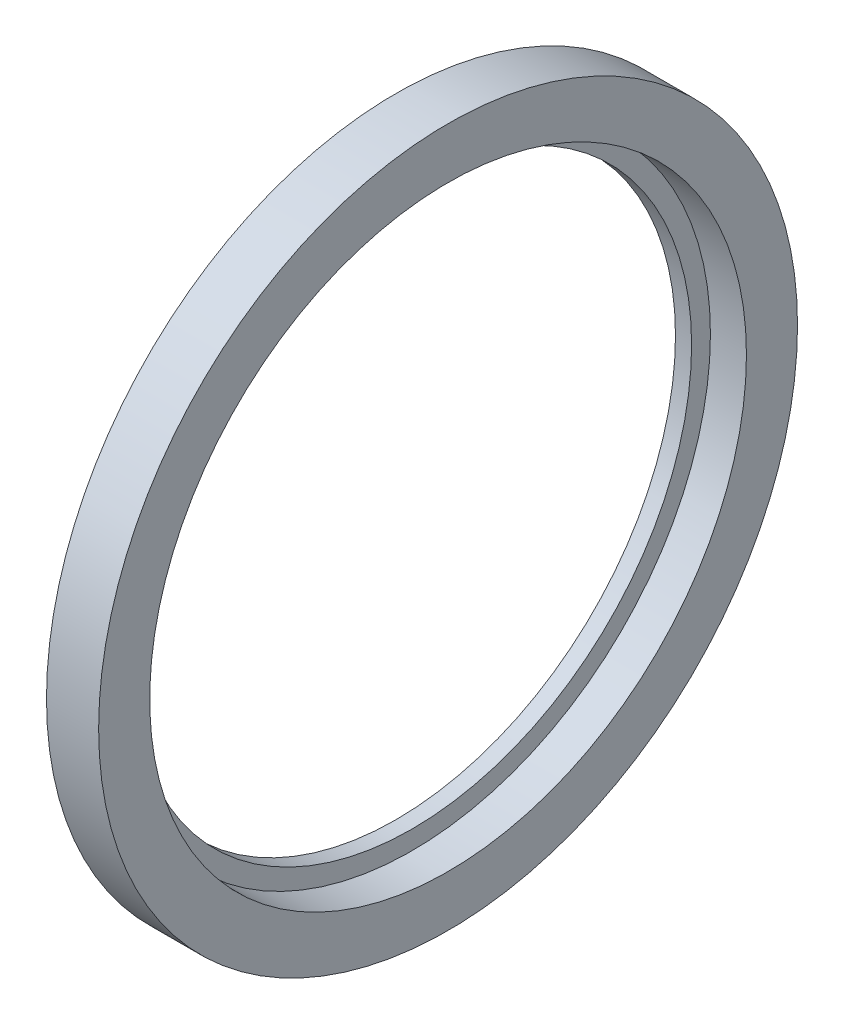
ISO-10303-21;
HEADER;
FILE_DESCRIPTION(('STEP AP214'),'2;1');
FILE_NAME('part.step','',(''),(''),'','','');
FILE_SCHEMA(('AUTOMOTIVE_DESIGN { 1 0 10303 214 1 1 1 1 }'));
ENDSEC;
DATA;
#1=APPLICATION_CONTEXT('core data for automotive mechanical design processes');
#2=APPLICATION_PROTOCOL_DEFINITION('international standard','automotive_design',2000,#1);
#3=PRODUCT_CONTEXT('',#1,'mechanical');
#4=PRODUCT('Part','Part','',(#3));
#5=PRODUCT_RELATED_PRODUCT_CATEGORY('part','',(#4));
#6=PRODUCT_DEFINITION_FORMATION('','',#4);
#7=PRODUCT_DEFINITION_CONTEXT('part definition',#1,'design');
#8=PRODUCT_DEFINITION('design','',#6,#7);
#9=PRODUCT_DEFINITION_SHAPE('','',#8);
#10=(LENGTH_UNIT() NAMED_UNIT(*) SI_UNIT(.MILLI.,.METRE.));
#11=(NAMED_UNIT(*) PLANE_ANGLE_UNIT() SI_UNIT($,.RADIAN.));
#12=(NAMED_UNIT(*) SI_UNIT($,.STERADIAN.) SOLID_ANGLE_UNIT());
#13=UNCERTAINTY_MEASURE_WITH_UNIT(LENGTH_MEASURE(1.E-05),#10,'distance_accuracy_value','');
#14=(GEOMETRIC_REPRESENTATION_CONTEXT(3) GLOBAL_UNCERTAINTY_ASSIGNED_CONTEXT((#13)) GLOBAL_UNIT_ASSIGNED_CONTEXT((#10,
#11,#12)) REPRESENTATION_CONTEXT('',''));
#15=CARTESIAN_POINT('',(0.,0.,0.));
#16=DIRECTION('',(0.,0.,1.));
#17=DIRECTION('',(1.,0.,0.));
#18=AXIS2_PLACEMENT_3D('',#15,#16,#17);
#19=CARTESIAN_POINT('',(12.285,0.,0.));
#20=DIRECTION('',(1.,0.,0.));
#21=DIRECTION('',(0.,0.,-1.));
#22=AXIS2_PLACEMENT_3D('',#19,#20,#21);
#23=CYLINDRICAL_SURFACE('',#22,52.);
#24=CARTESIAN_POINT('',(3.,0.,0.));
#25=DIRECTION('',(1.,0.,0.));
#26=DIRECTION('',(0.,0.,-1.));
#27=AXIS2_PLACEMENT_3D('',#24,#25,#26);
#28=CIRCLE('',#27,52.);
#29=CARTESIAN_POINT('',(3.,0.,-52.));
#30=VERTEX_POINT('',#29);
#31=EDGE_CURVE('E65',#30,#30,#28,.T.);
#32=ORIENTED_EDGE('',*,*,#31,.T.);
#33=EDGE_LOOP('',(#32));
#34=FACE_BOUND('',#33,.T.);
#35=CARTESIAN_POINT('',(0.,0.,0.));
#36=DIRECTION('',(1.,0.,0.));
#37=DIRECTION('',(0.,0.,-1.));
#38=AXIS2_PLACEMENT_3D('',#35,#36,#37);
#39=CIRCLE('',#38,52.);
#40=CARTESIAN_POINT('',(0.,0.,-52.));
#41=VERTEX_POINT('',#40);
#42=EDGE_CURVE('E12',#41,#41,#39,.T.);
#43=ORIENTED_EDGE('',*,*,#42,.F.);
#44=EDGE_LOOP('',(#43));
#45=FACE_BOUND('',#44,.T.);
#46=ADVANCED_FACE('F43',(#34,#45),#23,.F.);
#47=CARTESIAN_POINT('',(0.,52.,0.));
#48=DIRECTION('',(-1.,0.,0.));
#49=DIRECTION('',(0.,0.,1.));
#50=AXIS2_PLACEMENT_3D('',#47,#48,#49);
#51=PLANE('',#50);
#52=ORIENTED_EDGE('',*,*,#42,.T.);
#53=EDGE_LOOP('',(#52));
#54=FACE_BOUND('',#53,.T.);
#55=CARTESIAN_POINT('',(0.,0.,0.));
#56=DIRECTION('',(1.,0.,0.));
#57=DIRECTION('',(0.,0.,-1.));
#58=AXIS2_PLACEMENT_3D('',#55,#56,#57);
#59=CIRCLE('',#58,65.);
#60=CARTESIAN_POINT('',(0.,0.,-65.));
#61=VERTEX_POINT('',#60);
#62=EDGE_CURVE('E49',#61,#61,#59,.T.);
#63=ORIENTED_EDGE('',*,*,#62,.F.);
#64=EDGE_LOOP('',(#63));
#65=FACE_BOUND('',#64,.T.);
#66=ADVANCED_FACE('F83',(#54,#65),#51,.T.);
#67=CARTESIAN_POINT('',(12.285,0.,0.));
#68=DIRECTION('',(1.,0.,0.));
#69=DIRECTION('',(0.,0.,-1.));
#70=AXIS2_PLACEMENT_3D('',#67,#68,#69);
#71=CYLINDRICAL_SURFACE('',#70,65.);
#72=ORIENTED_EDGE('',*,*,#62,.T.);
#73=EDGE_LOOP('',(#72));
#74=FACE_BOUND('',#73,.T.);
#75=CARTESIAN_POINT('',(9.7,0.,0.));
#76=DIRECTION('',(1.,0.,0.));
#77=DIRECTION('',(0.,0.,-1.));
#78=AXIS2_PLACEMENT_3D('',#75,#76,#77);
#79=CIRCLE('',#78,65.);
#80=CARTESIAN_POINT('',(9.7,0.,-65.));
#81=VERTEX_POINT('',#80);
#82=EDGE_CURVE('E53',#81,#81,#79,.T.);
#83=ORIENTED_EDGE('',*,*,#82,.F.);
#84=EDGE_LOOP('',(#83));
#85=FACE_BOUND('',#84,.T.);
#86=ADVANCED_FACE('F87',(#74,#85),#71,.T.);
#87=CARTESIAN_POINT('',(9.7,65.,0.));
#88=DIRECTION('',(1.,0.,0.));
#89=DIRECTION('',(0.,0.,-1.));
#90=AXIS2_PLACEMENT_3D('',#87,#88,#89);
#91=PLANE('',#90);
#92=ORIENTED_EDGE('',*,*,#82,.T.);
#93=EDGE_LOOP('',(#92));
#94=FACE_BOUND('',#93,.T.);
#95=CARTESIAN_POINT('',(9.7,0.,0.));
#96=DIRECTION('',(1.,0.,0.));
#97=DIRECTION('',(0.,0.,-1.));
#98=AXIS2_PLACEMENT_3D('',#95,#96,#97);
#99=CIRCLE('',#98,55.5);
#100=CARTESIAN_POINT('',(9.7,0.,-55.5));
#101=VERTEX_POINT('',#100);
#102=EDGE_CURVE('E57',#101,#101,#99,.T.);
#103=ORIENTED_EDGE('',*,*,#102,.F.);
#104=EDGE_LOOP('',(#103));
#105=FACE_BOUND('',#104,.T.);
#106=ADVANCED_FACE('F79',(#94,#105),#91,.T.);
#107=CARTESIAN_POINT('',(12.285,0.,0.));
#108=DIRECTION('',(1.,0.,0.));
#109=DIRECTION('',(0.,0.,-1.));
#110=AXIS2_PLACEMENT_3D('',#107,#108,#109);
#111=CYLINDRICAL_SURFACE('',#110,55.5);
#112=ORIENTED_EDGE('',*,*,#102,.T.);
#113=EDGE_LOOP('',(#112));
#114=FACE_BOUND('',#113,.T.);
#115=CARTESIAN_POINT('',(3.,0.,0.));
#116=DIRECTION('',(1.,0.,0.));
#117=DIRECTION('',(0.,0.,-1.));
#118=AXIS2_PLACEMENT_3D('',#115,#116,#117);
#119=CIRCLE('',#118,55.5);
#120=CARTESIAN_POINT('',(3.,0.,-55.5));
#121=VERTEX_POINT('',#120);
#122=EDGE_CURVE('E62',#121,#121,#119,.T.);
#123=ORIENTED_EDGE('',*,*,#122,.F.);
#124=EDGE_LOOP('',(#123));
#125=FACE_BOUND('',#124,.T.);
#126=ADVANCED_FACE('F73',(#114,#125),#111,.F.);
#127=CARTESIAN_POINT('',(3.,55.5,0.));
#128=DIRECTION('',(1.,0.,0.));
#129=DIRECTION('',(0.,0.,-1.));
#130=AXIS2_PLACEMENT_3D('',#127,#128,#129);
#131=PLANE('',#130);
#132=ORIENTED_EDGE('',*,*,#122,.T.);
#133=EDGE_LOOP('',(#132));
#134=FACE_BOUND('',#133,.T.);
#135=ORIENTED_EDGE('',*,*,#31,.F.);
#136=EDGE_LOOP('',(#135));
#137=FACE_BOUND('',#136,.T.);
#138=ADVANCED_FACE('F71',(#134,#137),#131,.T.);
#139=CLOSED_SHELL('',(#46,#66,#86,#106,#126,#138));
#140=MANIFOLD_SOLID_BREP('B2',#139);
#141=ADVANCED_BREP_SHAPE_REPRESENTATION('',(#18,#140),#14);
#142=SHAPE_DEFINITION_REPRESENTATION(#9,#141);
ENDSEC;
END-ISO-10303-21;
